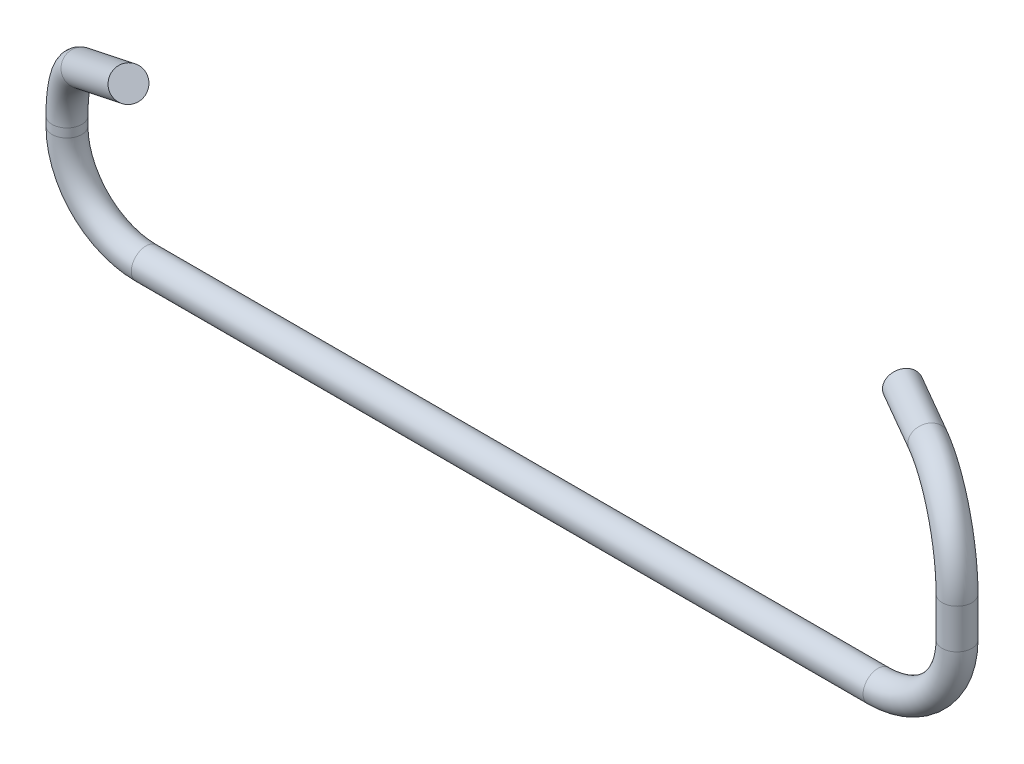
ISO-10303-21;
HEADER;
FILE_DESCRIPTION(('STEP AP214'),'2;1');
FILE_NAME('part.step','',(''),(''),'','','');
FILE_SCHEMA(('AUTOMOTIVE_DESIGN { 1 0 10303 214 1 1 1 1 }'));
ENDSEC;
DATA;
#1=APPLICATION_CONTEXT('core data for automotive mechanical design processes');
#2=APPLICATION_PROTOCOL_DEFINITION('international standard','automotive_design',2000,#1);
#3=PRODUCT_CONTEXT('',#1,'mechanical');
#4=PRODUCT('Part','Part','',(#3));
#5=PRODUCT_RELATED_PRODUCT_CATEGORY('part','',(#4));
#6=PRODUCT_DEFINITION_FORMATION('','',#4);
#7=PRODUCT_DEFINITION_CONTEXT('part definition',#1,'design');
#8=PRODUCT_DEFINITION('design','',#6,#7);
#9=PRODUCT_DEFINITION_SHAPE('','',#8);
#10=(LENGTH_UNIT() NAMED_UNIT(*) SI_UNIT(.MILLI.,.METRE.));
#11=(NAMED_UNIT(*) PLANE_ANGLE_UNIT() SI_UNIT($,.RADIAN.));
#12=(NAMED_UNIT(*) SI_UNIT($,.STERADIAN.) SOLID_ANGLE_UNIT());
#13=UNCERTAINTY_MEASURE_WITH_UNIT(LENGTH_MEASURE(1.E-05),#10,'distance_accuracy_value','');
#14=(GEOMETRIC_REPRESENTATION_CONTEXT(3) GLOBAL_UNCERTAINTY_ASSIGNED_CONTEXT((#13)) GLOBAL_UNIT_ASSIGNED_CONTEXT((#10,
#11,#12)) REPRESENTATION_CONTEXT('',''));
#15=CARTESIAN_POINT('',(0.,0.,0.));
#16=DIRECTION('',(0.,0.,1.));
#17=DIRECTION('',(1.,0.,0.));
#18=AXIS2_PLACEMENT_3D('',#15,#16,#17);
#19=CARTESIAN_POINT('',(-25.9807621135332,0.,-15.));
#20=DIRECTION('',(-0.866025403784438,0.,-0.500000000000002));
#21=DIRECTION('',(-0.346687622640772,-0.72057669212289,0.600480576769078));
#22=AXIS2_PLACEMENT_3D('',#19,#20,#21);
#23=PLANE('',#22);
#24=CARTESIAN_POINT('',(-25.9807621135332,0.,-15.));
#25=DIRECTION('',(-0.866025403784438,0.,-0.500000000000002));
#26=DIRECTION('',(-0.346687622640772,-0.72057669212289,0.600480576769078));
#27=AXIS2_PLACEMENT_3D('',#24,#25,#26);
#28=CIRCLE('',#27,3.);
#29=CARTESIAN_POINT('',(-27.0208249814555,-2.16173007636865,-13.1985582696928));
#30=VERTEX_POINT('',#29);
#31=EDGE_CURVE('E83',#30,#30,#28,.T.);
#32=ORIENTED_EDGE('',*,*,#31,.T.);
#33=EDGE_LOOP('',(#32));
#34=FACE_BOUND('',#33,.T.);
#35=ADVANCED_FACE('F49',(#34),#23,.T.);
#36=CARTESIAN_POINT('',(-150.555136271329,6.6299091524471,17.));
#37=DIRECTION('',(-0.750000000000002,-0.499999999999996,-0.43301270189222));
#38=DIRECTION('',(0.554700196225225,-0.832050294337846,0.));
#39=AXIS2_PLACEMENT_3D('',#36,#37,#38);
#40=PLANE('',#39);
#41=CARTESIAN_POINT('',(-150.555136271329,6.6299091524471,17.));
#42=DIRECTION('',(-0.750000000000002,-0.499999999999996,-0.43301270189222));
#43=DIRECTION('',(0.554700196225225,-0.832050294337846,0.));
#44=AXIS2_PLACEMENT_3D('',#41,#42,#43);
#45=CIRCLE('',#44,3.);
#46=CARTESIAN_POINT('',(-148.891035682653,4.13375826943357,17.));
#47=VERTEX_POINT('',#46);
#48=EDGE_CURVE('E11',#47,#47,#45,.T.);
#49=ORIENTED_EDGE('',*,*,#48,.F.);
#50=EDGE_LOOP('',(#49));
#51=FACE_BOUND('',#50,.T.);
#52=ADVANCED_FACE('F91',(#51),#40,.F.);
#53=CARTESIAN_POINT('',(-25.9807621135332,0.,-15.));
#54=DIRECTION('',(0.866025403784438,0.,0.500000000000001));
#55=DIRECTION('',(0.500000000000001,0.,-0.866025403784438));
#56=AXIS2_PLACEMENT_3D('',#53,#54,#55);
#57=CYLINDRICAL_SURFACE('',#56,3.);
#58=CARTESIAN_POINT('',(-13.856406460551,0.,-8.));
#59=DIRECTION('',(-0.866025403784438,0.,-0.500000000000002));
#60=DIRECTION('',(-0.346687622640772,-0.72057669212289,0.600480576769078));
#61=AXIS2_PLACEMENT_3D('',#58,#59,#60);
#62=CIRCLE('',#61,3.);
#63=CARTESIAN_POINT('',(-13.856406460551,3.00000000000001,-8.));
#64=VERTEX_POINT('',#63);
#65=EDGE_CURVE('E80',#64,#64,#62,.T.);
#66=ORIENTED_EDGE('',*,*,#65,.T.);
#67=EDGE_LOOP('',(#66));
#68=FACE_BOUND('',#67,.T.);
#69=ORIENTED_EDGE('',*,*,#31,.F.);
#70=EDGE_LOOP('',(#69));
#71=FACE_BOUND('',#70,.T.);
#72=ADVANCED_FACE('F88',(#68,#71),#57,.T.);
#73=CARTESIAN_POINT('',(-13.856406460551,-16.,-7.99999999999999));
#74=DIRECTION('',(0.500000000000001,0.,-0.866025403784438));
#75=DIRECTION('',(-0.866025403784438,0.,-0.500000000000001));
#76=AXIS2_PLACEMENT_3D('',#73,#74,#75);
#77=TOROIDAL_SURFACE('',#76,16.,3.);
#78=CARTESIAN_POINT('',(0.,-16.,0.));
#79=DIRECTION('',(0.,1.,0.));
#80=DIRECTION('',(-0.970725343394151,0.,0.240192230707633));
#81=AXIS2_PLACEMENT_3D('',#78,#79,#80);
#82=CIRCLE('',#81,3.);
#83=CARTESIAN_POINT('',(2.59807621135331,-16.,1.50000000000003));
#84=VERTEX_POINT('',#83);
#85=EDGE_CURVE('E77',#84,#84,#82,.T.);
#86=CARTESIAN_POINT('',(-13.856406460551,-16.,-7.99999999999999));
#87=DIRECTION('',(0.500000000000001,0.,-0.866025403784438));
#88=DIRECTION('',(-0.866025403784438,0.,-0.500000000000001));
#89=AXIS2_PLACEMENT_3D('',#86,#87,#88);
#90=CIRCLE('',#89,19.);
#91=EDGE_CURVE('',#64,#84,#90,.T.);
#92=ORIENTED_EDGE('',*,*,#65,.F.);
#93=ORIENTED_EDGE('',*,*,#85,.T.);
#94=ORIENTED_EDGE('',*,*,#91,.T.);
#95=ORIENTED_EDGE('',*,*,#91,.F.);
#96=EDGE_LOOP('',(#92,#94,#93,#95));
#97=FACE_BOUND('',#96,.T.);
#98=ADVANCED_FACE('F90',(#97),#77,.T.);
#99=CARTESIAN_POINT('',(0.,-16.,0.));
#100=DIRECTION('',(0.,-1.,0.));
#101=DIRECTION('',(1.,0.,0.));
#102=AXIS2_PLACEMENT_3D('',#99,#100,#101);
#103=CYLINDRICAL_SURFACE('',#102,3.);
#104=CARTESIAN_POINT('',(0.,-24.,0.));
#105=DIRECTION('',(0.,1.,0.));
#106=DIRECTION('',(-0.970725343394151,0.,0.240192230707633));
#107=AXIS2_PLACEMENT_3D('',#104,#105,#106);
#108=CIRCLE('',#107,3.);
#109=CARTESIAN_POINT('',(3.00000000000001,-24.,0.));
#110=VERTEX_POINT('',#109);
#111=EDGE_CURVE('E74',#110,#110,#108,.T.);
#112=ORIENTED_EDGE('',*,*,#111,.T.);
#113=EDGE_LOOP('',(#112));
#114=FACE_BOUND('',#113,.T.);
#115=ORIENTED_EDGE('',*,*,#85,.F.);
#116=EDGE_LOOP('',(#115));
#117=FACE_BOUND('',#116,.T.);
#118=ADVANCED_FACE('F98',(#114,#117),#103,.T.);
#119=CARTESIAN_POINT('',(-16.,-24.,0.));
#120=DIRECTION('',(0.,0.,-1.));
#121=DIRECTION('',(-1.,0.,0.));
#122=AXIS2_PLACEMENT_3D('',#119,#120,#121);
#123=TOROIDAL_SURFACE('',#122,16.,3.);
#124=CARTESIAN_POINT('',(-16.,-40.,0.));
#125=DIRECTION('',(1.,0.,0.));
#126=DIRECTION('',(0.,0.970725343394151,0.240192230707633));
#127=AXIS2_PLACEMENT_3D('',#124,#125,#126);
#128=CIRCLE('',#127,3.);
#129=CARTESIAN_POINT('',(-16.,-43.,0.));
#130=VERTEX_POINT('',#129);
#131=EDGE_CURVE('E71',#130,#130,#128,.T.);
#132=CARTESIAN_POINT('',(-16.,-24.,0.));
#133=DIRECTION('',(0.,0.,-1.));
#134=DIRECTION('',(-1.,0.,0.));
#135=AXIS2_PLACEMENT_3D('',#132,#133,#134);
#136=CIRCLE('',#135,19.);
#137=EDGE_CURVE('',#110,#130,#136,.T.);
#138=ORIENTED_EDGE('',*,*,#111,.F.);
#139=ORIENTED_EDGE('',*,*,#131,.T.);
#140=ORIENTED_EDGE('',*,*,#137,.T.);
#141=ORIENTED_EDGE('',*,*,#137,.F.);
#142=EDGE_LOOP('',(#138,#140,#139,#141));
#143=FACE_BOUND('',#142,.T.);
#144=ADVANCED_FACE('F123',(#143),#123,.T.);
#145=CARTESIAN_POINT('',(-16.,-40.,0.));
#146=DIRECTION('',(-1.,0.,0.));
#147=DIRECTION('',(0.,-1.,0.));
#148=AXIS2_PLACEMENT_3D('',#145,#146,#147);
#149=CYLINDRICAL_SURFACE('',#148,3.);
#150=CARTESIAN_POINT('',(-164.,-40.,0.));
#151=DIRECTION('',(1.,0.,0.));
#152=DIRECTION('',(0.,0.970725343394151,0.240192230707633));
#153=AXIS2_PLACEMENT_3D('',#150,#151,#152);
#154=CIRCLE('',#153,3.);
#155=CARTESIAN_POINT('',(-164.,-43.,0.));
#156=VERTEX_POINT('',#155);
#157=EDGE_CURVE('E68',#156,#156,#154,.T.);
#158=ORIENTED_EDGE('',*,*,#157,.T.);
#159=EDGE_LOOP('',(#158));
#160=FACE_BOUND('',#159,.T.);
#161=ORIENTED_EDGE('',*,*,#131,.F.);
#162=EDGE_LOOP('',(#161));
#163=FACE_BOUND('',#162,.T.);
#164=ADVANCED_FACE('F119',(#160,#163),#149,.T.);
#165=CARTESIAN_POINT('',(-164.,-24.,0.));
#166=DIRECTION('',(0.,0.,-1.));
#167=DIRECTION('',(-1.,0.,0.));
#168=AXIS2_PLACEMENT_3D('',#165,#166,#167);
#169=TOROIDAL_SURFACE('',#168,16.,3.);
#170=CARTESIAN_POINT('',(-180.,-24.,0.));
#171=DIRECTION('',(0.,-1.,0.));
#172=DIRECTION('',(0.970725343394151,0.,0.240192230707633));
#173=AXIS2_PLACEMENT_3D('',#170,#171,#172);
#174=CIRCLE('',#173,3.);
#175=CARTESIAN_POINT('',(-183.,-24.,0.));
#176=VERTEX_POINT('',#175);
#177=EDGE_CURVE('E63',#176,#176,#174,.T.);
#178=CARTESIAN_POINT('',(-164.,-24.,0.));
#179=DIRECTION('',(0.,0.,-1.));
#180=DIRECTION('',(-1.,0.,0.));
#181=AXIS2_PLACEMENT_3D('',#178,#179,#180);
#182=CIRCLE('',#181,19.);
#183=EDGE_CURVE('',#156,#176,#182,.T.);
#184=ORIENTED_EDGE('',*,*,#157,.F.);
#185=ORIENTED_EDGE('',*,*,#177,.T.);
#186=ORIENTED_EDGE('',*,*,#183,.T.);
#187=ORIENTED_EDGE('',*,*,#183,.F.);
#188=EDGE_LOOP('',(#184,#186,#185,#187));
#189=FACE_BOUND('',#188,.T.);
#190=ADVANCED_FACE('F115',(#189),#169,.T.);
#191=CARTESIAN_POINT('',(-180.,-24.,0.));
#192=DIRECTION('',(0.,1.,0.));
#193=DIRECTION('',(0.,0.,1.));
#194=AXIS2_PLACEMENT_3D('',#191,#192,#193);
#195=CYLINDRICAL_SURFACE('',#194,3.);
#196=CARTESIAN_POINT('',(-180.,-22.2376043070341,0.));
#197=DIRECTION('',(0.,-1.,0.));
#198=DIRECTION('',(0.970725343394151,0.,0.240192230707633));
#199=AXIS2_PLACEMENT_3D('',#196,#197,#198);
#200=CIRCLE('',#199,3.);
#201=CARTESIAN_POINT('',(-182.598076211353,-22.2376043070341,-1.49999999999998));
#202=VERTEX_POINT('',#201);
#203=EDGE_CURVE('E59',#202,#202,#200,.T.);
#204=ORIENTED_EDGE('',*,*,#203,.T.);
#205=EDGE_LOOP('',(#204));
#206=FACE_BOUND('',#205,.T.);
#207=ORIENTED_EDGE('',*,*,#177,.F.);
#208=EDGE_LOOP('',(#207));
#209=FACE_BOUND('',#208,.T.);
#210=ADVANCED_FACE('F109',(#206,#209),#195,.T.);
#211=CARTESIAN_POINT('',(-166.143593539449,-22.2376043070341,8.00000000000002));
#212=DIRECTION('',(0.500000000000001,0.,-0.866025403784438));
#213=DIRECTION('',(-0.866025403784438,0.,-0.500000000000001));
#214=AXIS2_PLACEMENT_3D('',#211,#212,#213);
#215=TOROIDAL_SURFACE('',#214,16.,3.);
#216=CARTESIAN_POINT('',(-173.071796769724,-8.38119784648344,4.00000000000002));
#217=DIRECTION('',(-0.750000000000002,-0.499999999999996,-0.43301270189222));
#218=DIRECTION('',(0.554700196225225,-0.832050294337846,0.));
#219=AXIS2_PLACEMENT_3D('',#216,#217,#218);
#220=CIRCLE('',#219,3.);
#221=CARTESIAN_POINT('',(-174.370834875401,-5.78312163512984,3.24999999999992));
#222=VERTEX_POINT('',#221);
#223=EDGE_CURVE('E55',#222,#222,#220,.T.);
#224=CARTESIAN_POINT('',(-166.143593539449,-22.2376043070341,8.00000000000002));
#225=DIRECTION('',(0.500000000000001,0.,-0.866025403784438));
#226=DIRECTION('',(-0.866025403784438,0.,-0.500000000000001));
#227=AXIS2_PLACEMENT_3D('',#224,#225,#226);
#228=CIRCLE('',#227,19.);
#229=EDGE_CURVE('',#202,#222,#228,.T.);
#230=ORIENTED_EDGE('',*,*,#203,.F.);
#231=ORIENTED_EDGE('',*,*,#223,.T.);
#232=ORIENTED_EDGE('',*,*,#229,.T.);
#233=ORIENTED_EDGE('',*,*,#229,.F.);
#234=EDGE_LOOP('',(#230,#232,#231,#233));
#235=FACE_BOUND('',#234,.T.);
#236=ADVANCED_FACE('F104',(#235),#215,.T.);
#237=CARTESIAN_POINT('',(-173.071796769724,-8.38119784648302,4.00000000000007));
#238=DIRECTION('',(0.750000000000001,0.499999999999997,0.433012701892221));
#239=DIRECTION('',(-0.554700196225227,0.832050294337845,0.));
#240=AXIS2_PLACEMENT_3D('',#237,#238,#239);
#241=CYLINDRICAL_SURFACE('',#240,3.);
#242=ORIENTED_EDGE('',*,*,#48,.T.);
#243=EDGE_LOOP('',(#242));
#244=FACE_BOUND('',#243,.T.);
#245=ORIENTED_EDGE('',*,*,#223,.F.);
#246=EDGE_LOOP('',(#245));
#247=FACE_BOUND('',#246,.T.);
#248=ADVANCED_FACE('F102',(#244,#247),#241,.T.);
#249=CLOSED_SHELL('',(#35,#52,#72,#98,#118,#144,#164,#190,#210,#236,#248));
#250=MANIFOLD_SOLID_BREP('B2',#249);
#251=ADVANCED_BREP_SHAPE_REPRESENTATION('',(#18,#250),#14);
#252=SHAPE_DEFINITION_REPRESENTATION(#9,#251);
ENDSEC;
END-ISO-10303-21;
